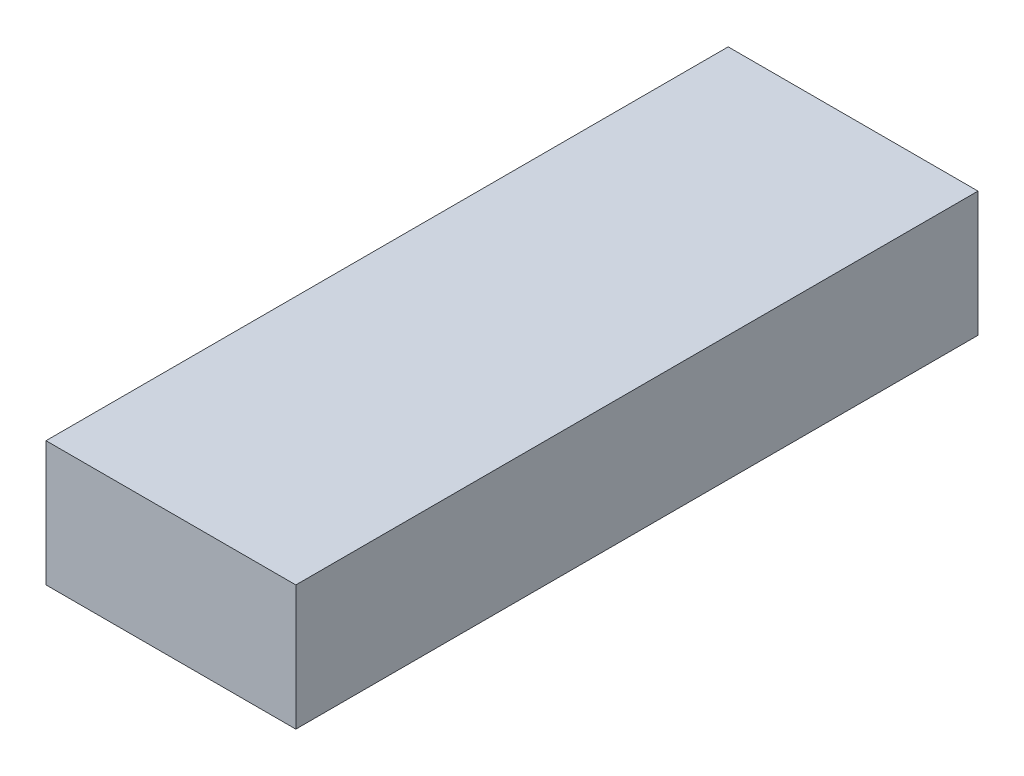
ISO-10303-21;
HEADER;
FILE_DESCRIPTION(('STEP AP214'),'2;1');
FILE_NAME('part.step','',(''),(''),'','','');
FILE_SCHEMA(('AUTOMOTIVE_DESIGN { 1 0 10303 214 1 1 1 1 }'));
ENDSEC;
DATA;
#1=APPLICATION_CONTEXT('core data for automotive mechanical design processes');
#2=APPLICATION_PROTOCOL_DEFINITION('international standard','automotive_design',2000,#1);
#3=PRODUCT_CONTEXT('',#1,'mechanical');
#4=PRODUCT('Part','Part','',(#3));
#5=PRODUCT_RELATED_PRODUCT_CATEGORY('part','',(#4));
#6=PRODUCT_DEFINITION_FORMATION('','',#4);
#7=PRODUCT_DEFINITION_CONTEXT('part definition',#1,'design');
#8=PRODUCT_DEFINITION('design','',#6,#7);
#9=PRODUCT_DEFINITION_SHAPE('','',#8);
#10=(LENGTH_UNIT() NAMED_UNIT(*) SI_UNIT(.MILLI.,.METRE.));
#11=(NAMED_UNIT(*) PLANE_ANGLE_UNIT() SI_UNIT($,.RADIAN.));
#12=(NAMED_UNIT(*) SI_UNIT($,.STERADIAN.) SOLID_ANGLE_UNIT());
#13=UNCERTAINTY_MEASURE_WITH_UNIT(LENGTH_MEASURE(1.E-05),#10,'distance_accuracy_value','');
#14=(GEOMETRIC_REPRESENTATION_CONTEXT(3) GLOBAL_UNCERTAINTY_ASSIGNED_CONTEXT((#13)) GLOBAL_UNIT_ASSIGNED_CONTEXT((#10,
#11,#12)) REPRESENTATION_CONTEXT('',''));
#15=CARTESIAN_POINT('',(0.,0.,0.));
#16=DIRECTION('',(0.,0.,1.));
#17=DIRECTION('',(1.,0.,0.));
#18=AXIS2_PLACEMENT_3D('',#15,#16,#17);
#19=CARTESIAN_POINT('',(0.,0.,0.));
#20=DIRECTION('',(0.,1.,0.));
#21=DIRECTION('',(1.,0.,0.));
#22=AXIS2_PLACEMENT_3D('',#19,#20,#21);
#23=PLANE('',#22);
#24=DIRECTION('',(1.,0.,0.));
#25=VECTOR('',#24,1.);
#26=CARTESIAN_POINT('',(-9.25,0.,-8.03938475262093));
#27=LINE('',#26,#25);
#28=CARTESIAN_POINT('',(-19.3569576670066,0.,-8.03938475262093));
#29=VERTEX_POINT('',#28);
#30=CARTESIAN_POINT('',(-18.3569576670066,0.,-8.03938475262093));
#31=VERTEX_POINT('',#30);
#32=EDGE_CURVE('E92',#29,#31,#27,.T.);
#33=ORIENTED_EDGE('',*,*,#32,.F.);
#34=DIRECTION('',(0.,0.,-1.));
#35=VECTOR('',#34,1.);
#36=CARTESIAN_POINT('',(-19.3569576670066,0.,-0.65));
#37=LINE('',#36,#35);
#38=CARTESIAN_POINT('',(-19.3569576670066,0.,-5.30889749588314));
#39=VERTEX_POINT('',#38);
#40=EDGE_CURVE('E28',#39,#29,#37,.T.);
#41=ORIENTED_EDGE('',*,*,#40,.F.);
#42=DIRECTION('',(1.,0.,0.));
#43=VECTOR('',#42,1.);
#44=CARTESIAN_POINT('',(-9.25,0.,-5.30889749588314));
#45=LINE('',#44,#43);
#46=CARTESIAN_POINT('',(-18.3569576670066,0.,-5.30889749588314));
#47=VERTEX_POINT('',#46);
#48=EDGE_CURVE('E54',#39,#47,#45,.T.);
#49=ORIENTED_EDGE('',*,*,#48,.T.);
#50=DIRECTION('',(0.,0.,-1.));
#51=VECTOR('',#50,1.);
#52=CARTESIAN_POINT('',(-18.3569576670066,0.,-0.65));
#53=LINE('',#52,#51);
#54=EDGE_CURVE('E95',#47,#31,#53,.T.);
#55=ORIENTED_EDGE('',*,*,#54,.T.);
#56=EDGE_LOOP('',(#33,#41,#49,#55));
#57=FACE_BOUND('',#56,.T.);
#58=ADVANCED_FACE('F17',(#57),#23,.T.);
#59=CARTESIAN_POINT('',(0.,-0.5,0.));
#60=DIRECTION('',(0.,1.,0.));
#61=DIRECTION('',(1.,0.,0.));
#62=AXIS2_PLACEMENT_3D('',#59,#60,#61);
#63=PLANE('',#62);
#64=DIRECTION('',(1.,0.,0.));
#65=VECTOR('',#64,1.);
#66=CARTESIAN_POINT('',(-9.25,-0.5,-8.03938475262093));
#67=LINE('',#66,#65);
#68=CARTESIAN_POINT('',(-19.3569576670066,-0.5,-8.03938475262093));
#69=VERTEX_POINT('',#68);
#70=CARTESIAN_POINT('',(-18.3569576670066,-0.5,-8.03938475262093));
#71=VERTEX_POINT('',#70);
#72=EDGE_CURVE('E93',#69,#71,#67,.T.);
#73=ORIENTED_EDGE('',*,*,#72,.T.);
#74=DIRECTION('',(0.,0.,-1.));
#75=VECTOR('',#74,1.);
#76=CARTESIAN_POINT('',(-18.3569576670066,-0.5,-0.65));
#77=LINE('',#76,#75);
#78=CARTESIAN_POINT('',(-18.3569576670066,-0.5,-5.30889749588314));
#79=VERTEX_POINT('',#78);
#80=EDGE_CURVE('E71',#79,#71,#77,.T.);
#81=ORIENTED_EDGE('',*,*,#80,.F.);
#82=DIRECTION('',(1.,0.,0.));
#83=VECTOR('',#82,1.);
#84=CARTESIAN_POINT('',(-9.25,-0.5,-5.30889749588314));
#85=LINE('',#84,#83);
#86=CARTESIAN_POINT('',(-19.3569576670066,-0.5,-5.30889749588314));
#87=VERTEX_POINT('',#86);
#88=EDGE_CURVE('E21',#87,#79,#85,.T.);
#89=ORIENTED_EDGE('',*,*,#88,.F.);
#90=DIRECTION('',(0.,0.,-1.));
#91=VECTOR('',#90,1.);
#92=CARTESIAN_POINT('',(-19.3569576670066,-0.5,-0.65));
#93=LINE('',#92,#91);
#94=EDGE_CURVE('E11',#87,#69,#93,.T.);
#95=ORIENTED_EDGE('',*,*,#94,.T.);
#96=EDGE_LOOP('',(#73,#81,#89,#95));
#97=FACE_BOUND('',#96,.T.);
#98=ADVANCED_FACE('F19',(#97),#63,.F.);
#99=CARTESIAN_POINT('',(-19.3569576670066,-0.5,-0.65));
#100=DIRECTION('',(1.,0.,0.));
#101=DIRECTION('',(0.,1.,0.));
#102=AXIS2_PLACEMENT_3D('',#99,#100,#101);
#103=PLANE('',#102);
#104=ORIENTED_EDGE('',*,*,#40,.T.);
#105=DIRECTION('',(0.,1.,0.));
#106=VECTOR('',#105,1.);
#107=CARTESIAN_POINT('',(-19.3569576670066,-0.5,-8.03938475262093));
#108=LINE('',#107,#106);
#109=EDGE_CURVE('E81',#69,#29,#108,.T.);
#110=ORIENTED_EDGE('',*,*,#109,.F.);
#111=ORIENTED_EDGE('',*,*,#94,.F.);
#112=DIRECTION('',(0.,1.,0.));
#113=VECTOR('',#112,1.);
#114=CARTESIAN_POINT('',(-19.3569576670066,-0.5,-5.30889749588314));
#115=LINE('',#114,#113);
#116=EDGE_CURVE('E84',#87,#39,#115,.T.);
#117=ORIENTED_EDGE('',*,*,#116,.T.);
#118=EDGE_LOOP('',(#104,#110,#111,#117));
#119=FACE_BOUND('',#118,.T.);
#120=ADVANCED_FACE('F80',(#119),#103,.F.);
#121=CARTESIAN_POINT('',(-9.25,-0.5,-5.30889749588314));
#122=DIRECTION('',(0.,0.,1.));
#123=DIRECTION('',(1.,0.,0.));
#124=AXIS2_PLACEMENT_3D('',#121,#122,#123);
#125=PLANE('',#124);
#126=ORIENTED_EDGE('',*,*,#48,.F.);
#127=ORIENTED_EDGE('',*,*,#116,.F.);
#128=ORIENTED_EDGE('',*,*,#88,.T.);
#129=DIRECTION('',(0.,1.,0.));
#130=VECTOR('',#129,1.);
#131=CARTESIAN_POINT('',(-18.3569576670066,-0.5,-5.30889749588314));
#132=LINE('',#131,#130);
#133=EDGE_CURVE('E110',#79,#47,#132,.T.);
#134=ORIENTED_EDGE('',*,*,#133,.T.);
#135=EDGE_LOOP('',(#126,#127,#128,#134));
#136=FACE_BOUND('',#135,.T.);
#137=ADVANCED_FACE('F124',(#136),#125,.T.);
#138=CARTESIAN_POINT('',(-18.3569576670066,-0.5,-0.65));
#139=DIRECTION('',(1.,0.,0.));
#140=DIRECTION('',(0.,1.,0.));
#141=AXIS2_PLACEMENT_3D('',#138,#139,#140);
#142=PLANE('',#141);
#143=ORIENTED_EDGE('',*,*,#54,.F.);
#144=ORIENTED_EDGE('',*,*,#133,.F.);
#145=ORIENTED_EDGE('',*,*,#80,.T.);
#146=DIRECTION('',(0.,1.,0.));
#147=VECTOR('',#146,1.);
#148=CARTESIAN_POINT('',(-18.3569576670066,-0.5,-8.03938475262093));
#149=LINE('',#148,#147);
#150=EDGE_CURVE('E99',#71,#31,#149,.T.);
#151=ORIENTED_EDGE('',*,*,#150,.T.);
#152=EDGE_LOOP('',(#143,#144,#145,#151));
#153=FACE_BOUND('',#152,.T.);
#154=ADVANCED_FACE('F125',(#153),#142,.T.);
#155=CARTESIAN_POINT('',(-9.25,-0.5,-8.03938475262093));
#156=DIRECTION('',(0.,0.,1.));
#157=DIRECTION('',(1.,0.,0.));
#158=AXIS2_PLACEMENT_3D('',#155,#156,#157);
#159=PLANE('',#158);
#160=ORIENTED_EDGE('',*,*,#32,.T.);
#161=ORIENTED_EDGE('',*,*,#150,.F.);
#162=ORIENTED_EDGE('',*,*,#72,.F.);
#163=ORIENTED_EDGE('',*,*,#109,.T.);
#164=EDGE_LOOP('',(#160,#161,#162,#163));
#165=FACE_BOUND('',#164,.T.);
#166=ADVANCED_FACE('F90',(#165),#159,.F.);
#167=CLOSED_SHELL('',(#58,#98,#120,#137,#154,#166));
#168=MANIFOLD_SOLID_BREP('B1',#167);
#169=ADVANCED_BREP_SHAPE_REPRESENTATION('',(#18,#168),#14);
#170=SHAPE_DEFINITION_REPRESENTATION(#9,#169);
ENDSEC;
END-ISO-10303-21;
